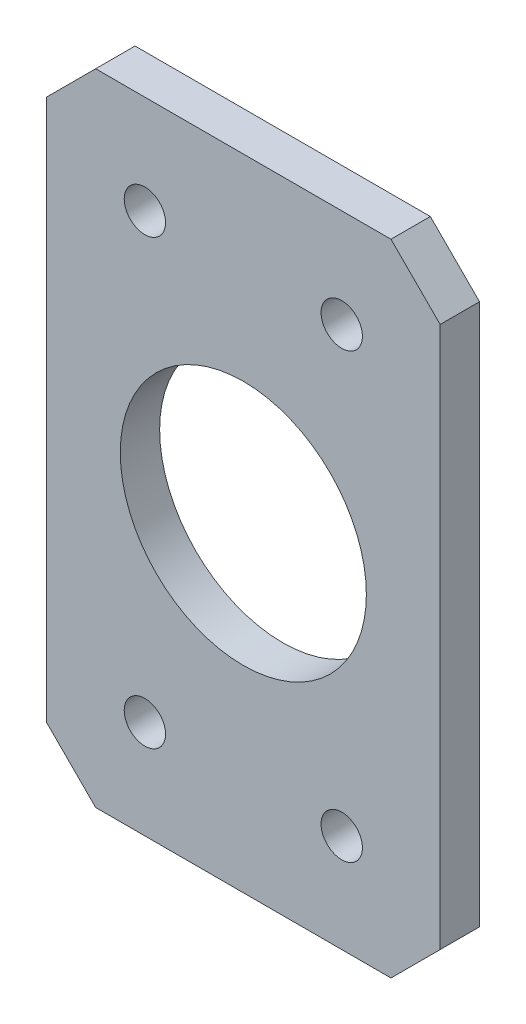
ISO-10303-21;
HEADER;
FILE_DESCRIPTION(('STEP AP214'),'2;1');
FILE_NAME('part.step','',(''),(''),'','','');
FILE_SCHEMA(('AUTOMOTIVE_DESIGN { 1 0 10303 214 1 1 1 1 }'));
ENDSEC;
DATA;
#1=APPLICATION_CONTEXT('core data for automotive mechanical design processes');
#2=APPLICATION_PROTOCOL_DEFINITION('international standard','automotive_design',2000,#1);
#3=PRODUCT_CONTEXT('',#1,'mechanical');
#4=PRODUCT('Part','Part','',(#3));
#5=PRODUCT_RELATED_PRODUCT_CATEGORY('part','',(#4));
#6=PRODUCT_DEFINITION_FORMATION('','',#4);
#7=PRODUCT_DEFINITION_CONTEXT('part definition',#1,'design');
#8=PRODUCT_DEFINITION('design','',#6,#7);
#9=PRODUCT_DEFINITION_SHAPE('','',#8);
#10=(LENGTH_UNIT() NAMED_UNIT(*) SI_UNIT(.MILLI.,.METRE.));
#11=(NAMED_UNIT(*) PLANE_ANGLE_UNIT() SI_UNIT($,.RADIAN.));
#12=(NAMED_UNIT(*) SI_UNIT($,.STERADIAN.) SOLID_ANGLE_UNIT());
#13=UNCERTAINTY_MEASURE_WITH_UNIT(LENGTH_MEASURE(1.E-05),#10,'distance_accuracy_value','');
#14=(GEOMETRIC_REPRESENTATION_CONTEXT(3) GLOBAL_UNCERTAINTY_ASSIGNED_CONTEXT((#13)) GLOBAL_UNIT_ASSIGNED_CONTEXT((#10,
#11,#12)) REPRESENTATION_CONTEXT('',''));
#15=CARTESIAN_POINT('',(0.,0.,0.));
#16=DIRECTION('',(0.,0.,1.));
#17=DIRECTION('',(1.,0.,0.));
#18=AXIS2_PLACEMENT_3D('',#15,#16,#17);
#19=CARTESIAN_POINT('',(0.,0.,2.));
#20=DIRECTION('',(0.,0.,1.));
#21=DIRECTION('',(1.,0.,0.));
#22=AXIS2_PLACEMENT_3D('',#19,#20,#21);
#23=PLANE('',#22);
#24=CARTESIAN_POINT('',(10.,-22.5,2.));
#25=DIRECTION('',(0.,0.,-1.));
#26=DIRECTION('',(-1.,0.,0.));
#27=AXIS2_PLACEMENT_3D('',#24,#25,#26);
#28=CIRCLE('',#27,2.1);
#29=CARTESIAN_POINT('',(7.9,-22.5,2.));
#30=VERTEX_POINT('',#29);
#31=EDGE_CURVE('E198',#30,#30,#28,.T.);
#32=ORIENTED_EDGE('',*,*,#31,.T.);
#33=EDGE_LOOP('',(#32));
#34=FACE_BOUND('',#33,.T.);
#35=CARTESIAN_POINT('',(-10.,-22.5,2.));
#36=DIRECTION('',(0.,0.,-1.));
#37=DIRECTION('',(-1.,0.,0.));
#38=AXIS2_PLACEMENT_3D('',#35,#36,#37);
#39=CIRCLE('',#38,2.1);
#40=CARTESIAN_POINT('',(-12.1,-22.5,2.));
#41=VERTEX_POINT('',#40);
#42=EDGE_CURVE('E201',#41,#41,#39,.T.);
#43=ORIENTED_EDGE('',*,*,#42,.T.);
#44=EDGE_LOOP('',(#43));
#45=FACE_BOUND('',#44,.T.);
#46=CARTESIAN_POINT('',(-10.,22.5,2.));
#47=DIRECTION('',(0.,0.,-1.));
#48=DIRECTION('',(-1.,0.,0.));
#49=AXIS2_PLACEMENT_3D('',#46,#47,#48);
#50=CIRCLE('',#49,2.1);
#51=CARTESIAN_POINT('',(-12.1,22.5,2.));
#52=VERTEX_POINT('',#51);
#53=EDGE_CURVE('E197',#52,#52,#50,.T.);
#54=ORIENTED_EDGE('',*,*,#53,.T.);
#55=EDGE_LOOP('',(#54));
#56=FACE_BOUND('',#55,.T.);
#57=CARTESIAN_POINT('',(10.,22.5,2.));
#58=DIRECTION('',(0.,0.,-1.));
#59=DIRECTION('',(-1.,0.,0.));
#60=AXIS2_PLACEMENT_3D('',#57,#58,#59);
#61=CIRCLE('',#60,2.1);
#62=CARTESIAN_POINT('',(7.9,22.5,2.));
#63=VERTEX_POINT('',#62);
#64=EDGE_CURVE('E144',#63,#63,#61,.T.);
#65=ORIENTED_EDGE('',*,*,#64,.T.);
#66=EDGE_LOOP('',(#65));
#67=FACE_BOUND('',#66,.T.);
#68=DIRECTION('',(0.,1.,0.));
#69=VECTOR('',#68,1.);
#70=CARTESIAN_POINT('',(20.,-32.5,2.));
#71=LINE('',#70,#69);
#72=CARTESIAN_POINT('',(20.,-27.5,2.));
#73=VERTEX_POINT('',#72);
#74=CARTESIAN_POINT('',(20.,27.5,2.));
#75=VERTEX_POINT('',#74);
#76=EDGE_CURVE('E189',#73,#75,#71,.T.);
#77=ORIENTED_EDGE('',*,*,#76,.T.);
#78=DIRECTION('',(0.707106781186546,-0.707106781186549,0.));
#79=VECTOR('',#78,1.);
#80=CARTESIAN_POINT('',(23.75,23.7499999999999,2.));
#81=LINE('',#80,#79);
#82=CARTESIAN_POINT('',(15.,32.5,2.));
#83=VERTEX_POINT('',#82);
#84=EDGE_CURVE('E167',#75,#83,#81,.F.);
#85=ORIENTED_EDGE('',*,*,#84,.T.);
#86=DIRECTION('',(-1.,0.,0.));
#87=VECTOR('',#86,1.);
#88=CARTESIAN_POINT('',(20.,32.5,2.));
#89=LINE('',#88,#87);
#90=CARTESIAN_POINT('',(-15.,32.5,2.));
#91=VERTEX_POINT('',#90);
#92=EDGE_CURVE('E124',#83,#91,#89,.T.);
#93=ORIENTED_EDGE('',*,*,#92,.T.);
#94=DIRECTION('',(0.707106781186548,0.707106781186548,0.));
#95=VECTOR('',#94,1.);
#96=CARTESIAN_POINT('',(-23.75,23.75,2.));
#97=LINE('',#96,#95);
#98=CARTESIAN_POINT('',(-20.,27.5,2.));
#99=VERTEX_POINT('',#98);
#100=EDGE_CURVE('E162',#91,#99,#97,.F.);
#101=ORIENTED_EDGE('',*,*,#100,.T.);
#102=DIRECTION('',(0.,-1.,0.));
#103=VECTOR('',#102,1.);
#104=CARTESIAN_POINT('',(-20.,-32.5,2.));
#105=LINE('',#104,#103);
#106=CARTESIAN_POINT('',(-20.,-27.5,2.));
#107=VERTEX_POINT('',#106);
#108=EDGE_CURVE('E131',#99,#107,#105,.T.);
#109=ORIENTED_EDGE('',*,*,#108,.T.);
#110=DIRECTION('',(-0.707106781186546,0.707106781186549,0.));
#111=VECTOR('',#110,1.);
#112=CARTESIAN_POINT('',(-23.75,-23.7499999999999,2.));
#113=LINE('',#112,#111);
#114=CARTESIAN_POINT('',(-15.,-32.5,2.));
#115=VERTEX_POINT('',#114);
#116=EDGE_CURVE('E60',#107,#115,#113,.F.);
#117=ORIENTED_EDGE('',*,*,#116,.T.);
#118=DIRECTION('',(1.,0.,0.));
#119=VECTOR('',#118,1.);
#120=CARTESIAN_POINT('',(20.,-32.5,2.));
#121=LINE('',#120,#119);
#122=CARTESIAN_POINT('',(15.,-32.5,2.));
#123=VERTEX_POINT('',#122);
#124=EDGE_CURVE('E134',#115,#123,#121,.T.);
#125=ORIENTED_EDGE('',*,*,#124,.T.);
#126=DIRECTION('',(-0.707106781186548,-0.707106781186547,0.));
#127=VECTOR('',#126,1.);
#128=CARTESIAN_POINT('',(23.75,-23.75,2.));
#129=LINE('',#128,#127);
#130=EDGE_CURVE('E165',#123,#73,#129,.F.);
#131=ORIENTED_EDGE('',*,*,#130,.T.);
#132=EDGE_LOOP('',(#77,#85,#93,#101,#109,#117,#125,#131));
#133=FACE_BOUND('',#132,.T.);
#134=CARTESIAN_POINT('',(0.,0.,2.));
#135=DIRECTION('',(0.,0.,1.));
#136=DIRECTION('',(1.,0.,0.));
#137=AXIS2_PLACEMENT_3D('',#134,#135,#136);
#138=CIRCLE('',#137,12.5);
#139=CARTESIAN_POINT('',(12.5,0.,2.));
#140=VERTEX_POINT('',#139);
#141=EDGE_CURVE('E183',#140,#140,#138,.T.);
#142=ORIENTED_EDGE('',*,*,#141,.F.);
#143=EDGE_LOOP('',(#142));
#144=FACE_BOUND('',#143,.T.);
#145=ADVANCED_FACE('F37',(#34,#45,#56,#67,#133,#144),#23,.T.);
#146=CARTESIAN_POINT('',(0.,0.,-2.));
#147=DIRECTION('',(0.,0.,1.));
#148=DIRECTION('',(1.,0.,0.));
#149=AXIS2_PLACEMENT_3D('',#146,#147,#148);
#150=PLANE('',#149);
#151=CARTESIAN_POINT('',(10.,-22.5,-2.));
#152=DIRECTION('',(0.,0.,1.));
#153=DIRECTION('',(1.,0.,0.));
#154=AXIS2_PLACEMENT_3D('',#151,#152,#153);
#155=CIRCLE('',#154,2.1);
#156=CARTESIAN_POINT('',(12.1,-22.5,-2.));
#157=VERTEX_POINT('',#156);
#158=EDGE_CURVE('E150',#157,#157,#155,.T.);
#159=ORIENTED_EDGE('',*,*,#158,.T.);
#160=EDGE_LOOP('',(#159));
#161=FACE_BOUND('',#160,.T.);
#162=CARTESIAN_POINT('',(-10.,-22.5,-2.));
#163=DIRECTION('',(0.,0.,1.));
#164=DIRECTION('',(1.,0.,0.));
#165=AXIS2_PLACEMENT_3D('',#162,#163,#164);
#166=CIRCLE('',#165,2.1);
#167=CARTESIAN_POINT('',(-7.9,-22.5,-2.));
#168=VERTEX_POINT('',#167);
#169=EDGE_CURVE('E147',#168,#168,#166,.T.);
#170=ORIENTED_EDGE('',*,*,#169,.T.);
#171=EDGE_LOOP('',(#170));
#172=FACE_BOUND('',#171,.T.);
#173=CARTESIAN_POINT('',(-10.,22.5,-2.));
#174=DIRECTION('',(0.,0.,1.));
#175=DIRECTION('',(1.,0.,0.));
#176=AXIS2_PLACEMENT_3D('',#173,#174,#175);
#177=CIRCLE('',#176,2.1);
#178=CARTESIAN_POINT('',(-7.9,22.5,-2.));
#179=VERTEX_POINT('',#178);
#180=EDGE_CURVE('E143',#179,#179,#177,.T.);
#181=ORIENTED_EDGE('',*,*,#180,.T.);
#182=EDGE_LOOP('',(#181));
#183=FACE_BOUND('',#182,.T.);
#184=CARTESIAN_POINT('',(10.,22.5,-2.));
#185=DIRECTION('',(0.,0.,1.));
#186=DIRECTION('',(1.,0.,0.));
#187=AXIS2_PLACEMENT_3D('',#184,#185,#186);
#188=CIRCLE('',#187,2.1);
#189=CARTESIAN_POINT('',(12.1,22.5,-2.));
#190=VERTEX_POINT('',#189);
#191=EDGE_CURVE('E140',#190,#190,#188,.T.);
#192=ORIENTED_EDGE('',*,*,#191,.T.);
#193=EDGE_LOOP('',(#192));
#194=FACE_BOUND('',#193,.T.);
#195=DIRECTION('',(-1.,0.,0.));
#196=VECTOR('',#195,1.);
#197=CARTESIAN_POINT('',(20.,32.5,-2.));
#198=LINE('',#197,#196);
#199=CARTESIAN_POINT('',(15.,32.5,-2.));
#200=VERTEX_POINT('',#199);
#201=CARTESIAN_POINT('',(-15.,32.5,-2.));
#202=VERTEX_POINT('',#201);
#203=EDGE_CURVE('E121',#200,#202,#198,.T.);
#204=ORIENTED_EDGE('',*,*,#203,.F.);
#205=DIRECTION('',(-0.707106781186546,0.707106781186549,0.));
#206=VECTOR('',#205,1.);
#207=CARTESIAN_POINT('',(15.,32.5,-2.));
#208=LINE('',#207,#206);
#209=CARTESIAN_POINT('',(20.,27.5,-2.));
#210=VERTEX_POINT('',#209);
#211=EDGE_CURVE('E104',#200,#210,#208,.F.);
#212=ORIENTED_EDGE('',*,*,#211,.T.);
#213=DIRECTION('',(0.,1.,0.));
#214=VECTOR('',#213,1.);
#215=CARTESIAN_POINT('',(20.,-32.5,-2.));
#216=LINE('',#215,#214);
#217=CARTESIAN_POINT('',(20.,-27.5,-2.));
#218=VERTEX_POINT('',#217);
#219=EDGE_CURVE('E132',#218,#210,#216,.T.);
#220=ORIENTED_EDGE('',*,*,#219,.F.);
#221=DIRECTION('',(0.707106781186548,0.707106781186547,0.));
#222=VECTOR('',#221,1.);
#223=CARTESIAN_POINT('',(20.,-27.5,-2.));
#224=LINE('',#223,#222);
#225=CARTESIAN_POINT('',(15.,-32.5,-2.));
#226=VERTEX_POINT('',#225);
#227=EDGE_CURVE('E115',#218,#226,#224,.F.);
#228=ORIENTED_EDGE('',*,*,#227,.T.);
#229=DIRECTION('',(1.,0.,0.));
#230=VECTOR('',#229,1.);
#231=CARTESIAN_POINT('',(20.,-32.5,-2.));
#232=LINE('',#231,#230);
#233=CARTESIAN_POINT('',(-15.,-32.5,-2.));
#234=VERTEX_POINT('',#233);
#235=EDGE_CURVE('E136',#234,#226,#232,.T.);
#236=ORIENTED_EDGE('',*,*,#235,.F.);
#237=DIRECTION('',(0.707106781186546,-0.707106781186549,0.));
#238=VECTOR('',#237,1.);
#239=CARTESIAN_POINT('',(-15.,-32.5,-2.));
#240=LINE('',#239,#238);
#241=CARTESIAN_POINT('',(-20.,-27.5,-2.));
#242=VERTEX_POINT('',#241);
#243=EDGE_CURVE('E156',#234,#242,#240,.F.);
#244=ORIENTED_EDGE('',*,*,#243,.T.);
#245=DIRECTION('',(0.,-1.,0.));
#246=VECTOR('',#245,1.);
#247=CARTESIAN_POINT('',(-20.,-32.5,-2.));
#248=LINE('',#247,#246);
#249=CARTESIAN_POINT('',(-20.,27.5,-2.));
#250=VERTEX_POINT('',#249);
#251=EDGE_CURVE('E178',#250,#242,#248,.T.);
#252=ORIENTED_EDGE('',*,*,#251,.F.);
#253=DIRECTION('',(-0.707106781186548,-0.707106781186548,0.));
#254=VECTOR('',#253,1.);
#255=CARTESIAN_POINT('',(-20.,27.5,-2.));
#256=LINE('',#255,#254);
#257=EDGE_CURVE('E125',#250,#202,#256,.F.);
#258=ORIENTED_EDGE('',*,*,#257,.T.);
#259=EDGE_LOOP('',(#204,#212,#220,#228,#236,#244,#252,#258));
#260=FACE_BOUND('',#259,.T.);
#261=CARTESIAN_POINT('',(0.,0.,-2.));
#262=DIRECTION('',(0.,0.,1.));
#263=DIRECTION('',(1.,0.,0.));
#264=AXIS2_PLACEMENT_3D('',#261,#262,#263);
#265=CIRCLE('',#264,12.5);
#266=CARTESIAN_POINT('',(12.5,0.,-2.));
#267=VERTEX_POINT('',#266);
#268=EDGE_CURVE('E153',#267,#267,#265,.T.);
#269=ORIENTED_EDGE('',*,*,#268,.T.);
#270=EDGE_LOOP('',(#269));
#271=FACE_BOUND('',#270,.T.);
#272=ADVANCED_FACE('F128',(#161,#172,#183,#194,#260,#271),#150,.F.);
#273=CARTESIAN_POINT('',(-20.,-32.5,2.));
#274=DIRECTION('',(1.,0.,0.));
#275=DIRECTION('',(0.,0.,-1.));
#276=AXIS2_PLACEMENT_3D('',#273,#274,#275);
#277=PLANE('',#276);
#278=ORIENTED_EDGE('',*,*,#251,.T.);
#279=DIRECTION('',(0.,0.,1.));
#280=VECTOR('',#279,1.);
#281=CARTESIAN_POINT('',(-20.,-27.5,2.));
#282=LINE('',#281,#280);
#283=EDGE_CURVE('E11',#242,#107,#282,.T.);
#284=ORIENTED_EDGE('',*,*,#283,.T.);
#285=ORIENTED_EDGE('',*,*,#108,.F.);
#286=DIRECTION('',(0.,0.,-1.));
#287=VECTOR('',#286,1.);
#288=CARTESIAN_POINT('',(-20.,27.5,2.));
#289=LINE('',#288,#287);
#290=EDGE_CURVE('E46',#99,#250,#289,.T.);
#291=ORIENTED_EDGE('',*,*,#290,.T.);
#292=EDGE_LOOP('',(#278,#284,#285,#291));
#293=FACE_BOUND('',#292,.T.);
#294=ADVANCED_FACE('F177',(#293),#277,.F.);
#295=CARTESIAN_POINT('',(20.,-32.5,2.));
#296=DIRECTION('',(0.,1.,0.));
#297=DIRECTION('',(-1.,0.,0.));
#298=AXIS2_PLACEMENT_3D('',#295,#296,#297);
#299=PLANE('',#298);
#300=ORIENTED_EDGE('',*,*,#235,.T.);
#301=DIRECTION('',(0.,0.,1.));
#302=VECTOR('',#301,1.);
#303=CARTESIAN_POINT('',(15.,-32.5,2.));
#304=LINE('',#303,#302);
#305=EDGE_CURVE('E53',#226,#123,#304,.T.);
#306=ORIENTED_EDGE('',*,*,#305,.T.);
#307=ORIENTED_EDGE('',*,*,#124,.F.);
#308=DIRECTION('',(0.,0.,-1.));
#309=VECTOR('',#308,1.);
#310=CARTESIAN_POINT('',(-15.,-32.5,2.));
#311=LINE('',#310,#309);
#312=EDGE_CURVE('E169',#115,#234,#311,.T.);
#313=ORIENTED_EDGE('',*,*,#312,.T.);
#314=EDGE_LOOP('',(#300,#306,#307,#313));
#315=FACE_BOUND('',#314,.T.);
#316=ADVANCED_FACE('F246',(#315),#299,.F.);
#317=CARTESIAN_POINT('',(20.,-32.5,2.));
#318=DIRECTION('',(-1.,0.,0.));
#319=DIRECTION('',(0.,0.,1.));
#320=AXIS2_PLACEMENT_3D('',#317,#318,#319);
#321=PLANE('',#320);
#322=ORIENTED_EDGE('',*,*,#219,.T.);
#323=DIRECTION('',(0.,0.,1.));
#324=VECTOR('',#323,1.);
#325=CARTESIAN_POINT('',(20.,27.5,2.));
#326=LINE('',#325,#324);
#327=EDGE_CURVE('E109',#210,#75,#326,.T.);
#328=ORIENTED_EDGE('',*,*,#327,.T.);
#329=ORIENTED_EDGE('',*,*,#76,.F.);
#330=DIRECTION('',(0.,0.,-1.));
#331=VECTOR('',#330,1.);
#332=CARTESIAN_POINT('',(20.,-27.5,2.));
#333=LINE('',#332,#331);
#334=EDGE_CURVE('E114',#73,#218,#333,.T.);
#335=ORIENTED_EDGE('',*,*,#334,.T.);
#336=EDGE_LOOP('',(#322,#328,#329,#335));
#337=FACE_BOUND('',#336,.T.);
#338=ADVANCED_FACE('F243',(#337),#321,.F.);
#339=CARTESIAN_POINT('',(20.,32.5,2.));
#340=DIRECTION('',(0.,-1.,0.));
#341=DIRECTION('',(1.,0.,0.));
#342=AXIS2_PLACEMENT_3D('',#339,#340,#341);
#343=PLANE('',#342);
#344=ORIENTED_EDGE('',*,*,#92,.F.);
#345=DIRECTION('',(0.,0.,-1.));
#346=VECTOR('',#345,1.);
#347=CARTESIAN_POINT('',(15.,32.5,2.));
#348=LINE('',#347,#346);
#349=EDGE_CURVE('E108',#83,#200,#348,.T.);
#350=ORIENTED_EDGE('',*,*,#349,.T.);
#351=ORIENTED_EDGE('',*,*,#203,.T.);
#352=DIRECTION('',(0.,0.,1.));
#353=VECTOR('',#352,1.);
#354=CARTESIAN_POINT('',(-15.,32.5,2.));
#355=LINE('',#354,#353);
#356=EDGE_CURVE('E126',#202,#91,#355,.T.);
#357=ORIENTED_EDGE('',*,*,#356,.T.);
#358=EDGE_LOOP('',(#344,#350,#351,#357));
#359=FACE_BOUND('',#358,.T.);
#360=ADVANCED_FACE('F120',(#359),#343,.F.);
#361=CARTESIAN_POINT('',(0.,0.,2.));
#362=DIRECTION('',(0.,0.,-1.));
#363=DIRECTION('',(-1.,0.,0.));
#364=AXIS2_PLACEMENT_3D('',#361,#362,#363);
#365=CYLINDRICAL_SURFACE('',#364,12.5);
#366=ORIENTED_EDGE('',*,*,#141,.T.);
#367=EDGE_LOOP('',(#366));
#368=FACE_BOUND('',#367,.T.);
#369=ORIENTED_EDGE('',*,*,#268,.F.);
#370=EDGE_LOOP('',(#369));
#371=FACE_BOUND('',#370,.T.);
#372=ADVANCED_FACE('F224',(#368,#371),#365,.F.);
#373=CARTESIAN_POINT('',(10.,22.5,2.));
#374=DIRECTION('',(0.,0.,-1.));
#375=DIRECTION('',(-1.,0.,0.));
#376=AXIS2_PLACEMENT_3D('',#373,#374,#375);
#377=CYLINDRICAL_SURFACE('',#376,2.1);
#378=ORIENTED_EDGE('',*,*,#64,.F.);
#379=EDGE_LOOP('',(#378));
#380=FACE_BOUND('',#379,.T.);
#381=ORIENTED_EDGE('',*,*,#191,.F.);
#382=EDGE_LOOP('',(#381));
#383=FACE_BOUND('',#382,.T.);
#384=ADVANCED_FACE('F213',(#380,#383),#377,.F.);
#385=CARTESIAN_POINT('',(-10.,22.5,2.));
#386=DIRECTION('',(0.,0.,-1.));
#387=DIRECTION('',(-1.,0.,0.));
#388=AXIS2_PLACEMENT_3D('',#385,#386,#387);
#389=CYLINDRICAL_SURFACE('',#388,2.1);
#390=ORIENTED_EDGE('',*,*,#53,.F.);
#391=EDGE_LOOP('',(#390));
#392=FACE_BOUND('',#391,.T.);
#393=ORIENTED_EDGE('',*,*,#180,.F.);
#394=EDGE_LOOP('',(#393));
#395=FACE_BOUND('',#394,.T.);
#396=ADVANCED_FACE('F209',(#392,#395),#389,.F.);
#397=CARTESIAN_POINT('',(-10.,-22.5,2.));
#398=DIRECTION('',(0.,0.,-1.));
#399=DIRECTION('',(-1.,0.,0.));
#400=AXIS2_PLACEMENT_3D('',#397,#398,#399);
#401=CYLINDRICAL_SURFACE('',#400,2.1);
#402=ORIENTED_EDGE('',*,*,#42,.F.);
#403=EDGE_LOOP('',(#402));
#404=FACE_BOUND('',#403,.T.);
#405=ORIENTED_EDGE('',*,*,#169,.F.);
#406=EDGE_LOOP('',(#405));
#407=FACE_BOUND('',#406,.T.);
#408=ADVANCED_FACE('F212',(#404,#407),#401,.F.);
#409=CARTESIAN_POINT('',(10.,-22.5,2.));
#410=DIRECTION('',(0.,0.,-1.));
#411=DIRECTION('',(-1.,0.,0.));
#412=AXIS2_PLACEMENT_3D('',#409,#410,#411);
#413=CYLINDRICAL_SURFACE('',#412,2.1);
#414=ORIENTED_EDGE('',*,*,#31,.F.);
#415=EDGE_LOOP('',(#414));
#416=FACE_BOUND('',#415,.T.);
#417=ORIENTED_EDGE('',*,*,#158,.F.);
#418=EDGE_LOOP('',(#417));
#419=FACE_BOUND('',#418,.T.);
#420=ADVANCED_FACE('F259',(#416,#419),#413,.F.);
#421=CARTESIAN_POINT('',(15.,32.5,2.));
#422=DIRECTION('',(-0.707106781186549,-0.707106781186546,0.));
#423=DIRECTION('',(0.,0.,-1.));
#424=AXIS2_PLACEMENT_3D('',#421,#422,#423);
#425=PLANE('',#424);
#426=ORIENTED_EDGE('',*,*,#84,.F.);
#427=ORIENTED_EDGE('',*,*,#327,.F.);
#428=ORIENTED_EDGE('',*,*,#211,.F.);
#429=ORIENTED_EDGE('',*,*,#349,.F.);
#430=EDGE_LOOP('',(#426,#427,#428,#429));
#431=FACE_BOUND('',#430,.T.);
#432=ADVANCED_FACE('F107',(#431),#425,.F.);
#433=CARTESIAN_POINT('',(20.,-27.5,2.));
#434=DIRECTION('',(-0.707106781186547,0.707106781186548,0.));
#435=DIRECTION('',(0.,0.,-1.));
#436=AXIS2_PLACEMENT_3D('',#433,#434,#435);
#437=PLANE('',#436);
#438=ORIENTED_EDGE('',*,*,#130,.F.);
#439=ORIENTED_EDGE('',*,*,#305,.F.);
#440=ORIENTED_EDGE('',*,*,#227,.F.);
#441=ORIENTED_EDGE('',*,*,#334,.F.);
#442=EDGE_LOOP('',(#438,#439,#440,#441));
#443=FACE_BOUND('',#442,.T.);
#444=ADVANCED_FACE('F258',(#443),#437,.F.);
#445=CARTESIAN_POINT('',(-15.,-32.5,2.));
#446=DIRECTION('',(0.707106781186549,0.707106781186546,0.));
#447=DIRECTION('',(0.,0.,-1.));
#448=AXIS2_PLACEMENT_3D('',#445,#446,#447);
#449=PLANE('',#448);
#450=ORIENTED_EDGE('',*,*,#116,.F.);
#451=ORIENTED_EDGE('',*,*,#283,.F.);
#452=ORIENTED_EDGE('',*,*,#243,.F.);
#453=ORIENTED_EDGE('',*,*,#312,.F.);
#454=EDGE_LOOP('',(#450,#451,#452,#453));
#455=FACE_BOUND('',#454,.T.);
#456=ADVANCED_FACE('F264',(#455),#449,.F.);
#457=CARTESIAN_POINT('',(-20.,27.5,2.));
#458=DIRECTION('',(0.707106781186548,-0.707106781186548,0.));
#459=DIRECTION('',(0.,0.,-1.));
#460=AXIS2_PLACEMENT_3D('',#457,#458,#459);
#461=PLANE('',#460);
#462=ORIENTED_EDGE('',*,*,#100,.F.);
#463=ORIENTED_EDGE('',*,*,#356,.F.);
#464=ORIENTED_EDGE('',*,*,#257,.F.);
#465=ORIENTED_EDGE('',*,*,#290,.F.);
#466=EDGE_LOOP('',(#462,#463,#464,#465));
#467=FACE_BOUND('',#466,.T.);
#468=ADVANCED_FACE('F40',(#467),#461,.F.);
#469=CLOSED_SHELL('',(#145,#272,#294,#316,#338,#360,#372,#384,#396,#408,#420,#432,#444,#456,#468));
#470=MANIFOLD_SOLID_BREP('B2',#469);
#471=ADVANCED_BREP_SHAPE_REPRESENTATION('',(#18,#470),#14);
#472=SHAPE_DEFINITION_REPRESENTATION(#9,#471);
ENDSEC;
END-ISO-10303-21;
